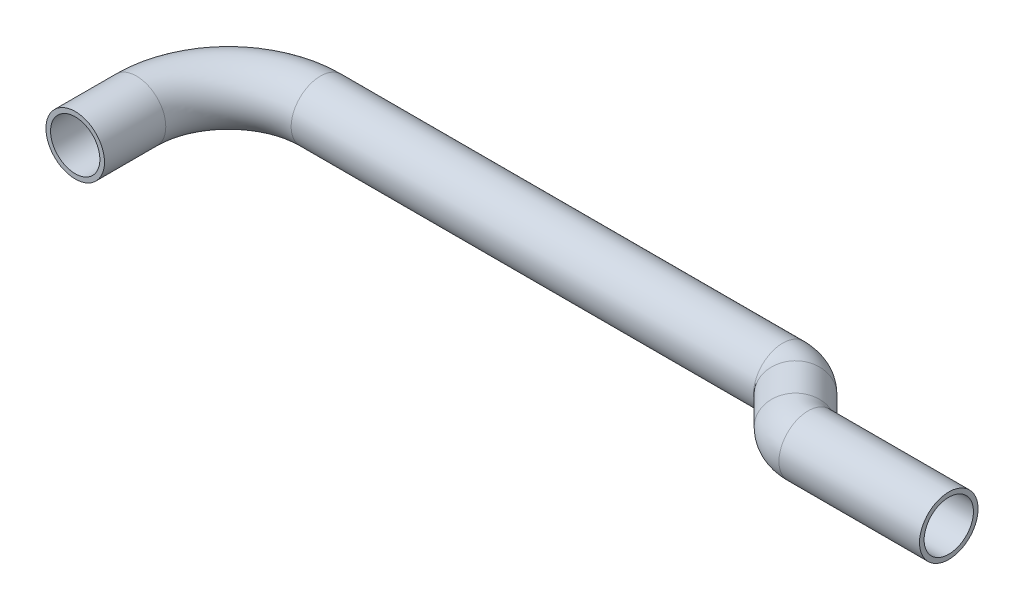
ISO-10303-21;
HEADER;
FILE_DESCRIPTION(('STEP AP214'),'2;1');
FILE_NAME('part.step','',(''),(''),'','','');
FILE_SCHEMA(('AUTOMOTIVE_DESIGN { 1 0 10303 214 1 1 1 1 }'));
ENDSEC;
DATA;
#1=APPLICATION_CONTEXT('core data for automotive mechanical design processes');
#2=APPLICATION_PROTOCOL_DEFINITION('international standard','automotive_design',2000,#1);
#3=PRODUCT_CONTEXT('',#1,'mechanical');
#4=PRODUCT('Part','Part','',(#3));
#5=PRODUCT_RELATED_PRODUCT_CATEGORY('part','',(#4));
#6=PRODUCT_DEFINITION_FORMATION('','',#4);
#7=PRODUCT_DEFINITION_CONTEXT('part definition',#1,'design');
#8=PRODUCT_DEFINITION('design','',#6,#7);
#9=PRODUCT_DEFINITION_SHAPE('','',#8);
#10=(LENGTH_UNIT() NAMED_UNIT(*) SI_UNIT(.MILLI.,.METRE.));
#11=(NAMED_UNIT(*) PLANE_ANGLE_UNIT() SI_UNIT($,.RADIAN.));
#12=(NAMED_UNIT(*) SI_UNIT($,.STERADIAN.) SOLID_ANGLE_UNIT());
#13=UNCERTAINTY_MEASURE_WITH_UNIT(LENGTH_MEASURE(1.E-05),#10,'distance_accuracy_value','');
#14=(GEOMETRIC_REPRESENTATION_CONTEXT(3) GLOBAL_UNCERTAINTY_ASSIGNED_CONTEXT((#13)) GLOBAL_UNIT_ASSIGNED_CONTEXT((#10,
#11,#12)) REPRESENTATION_CONTEXT('',''));
#15=CARTESIAN_POINT('',(0.,0.,0.));
#16=DIRECTION('',(0.,0.,1.));
#17=DIRECTION('',(1.,0.,0.));
#18=AXIS2_PLACEMENT_3D('',#15,#16,#17);
#19=CARTESIAN_POINT('',(204.142135623731,0.,-35.));
#20=DIRECTION('',(1.,0.,0.));
#21=DIRECTION('',(0.,0.,-1.));
#22=AXIS2_PLACEMENT_3D('',#19,#20,#21);
#23=CYLINDRICAL_SURFACE('',#22,9.55);
#24=CARTESIAN_POINT('',(204.142135623731,0.,-35.));
#25=DIRECTION('',(-1.,0.,0.));
#26=DIRECTION('',(0.,0.,1.));
#27=AXIS2_PLACEMENT_3D('',#24,#25,#26);
#28=CIRCLE('',#27,9.55);
#29=CARTESIAN_POINT('',(204.142135623731,0.,-25.45));
#30=VERTEX_POINT('',#29);
#31=EDGE_CURVE('E41',#30,#30,#28,.T.);
#32=ORIENTED_EDGE('',*,*,#31,.F.);
#33=EDGE_LOOP('',(#32));
#34=FACE_BOUND('',#33,.T.);
#35=CARTESIAN_POINT('',(250.,0.,-35.));
#36=DIRECTION('',(-1.,0.,0.));
#37=DIRECTION('',(0.,0.,1.));
#38=AXIS2_PLACEMENT_3D('',#35,#36,#37);
#39=CIRCLE('',#38,9.55);
#40=CARTESIAN_POINT('',(250.,0.,-25.45));
#41=VERTEX_POINT('',#40);
#42=EDGE_CURVE('E10',#41,#41,#39,.T.);
#43=ORIENTED_EDGE('',*,*,#42,.T.);
#44=EDGE_LOOP('',(#43));
#45=FACE_BOUND('',#44,.T.);
#46=ADVANCED_FACE('F31',(#34,#45),#23,.T.);
#47=CARTESIAN_POINT('',(204.142135623731,0.,-35.));
#48=DIRECTION('',(1.,0.,0.));
#49=DIRECTION('',(0.,0.,-1.));
#50=AXIS2_PLACEMENT_3D('',#47,#48,#49);
#51=CYLINDRICAL_SURFACE('',#50,8.05);
#52=CARTESIAN_POINT('',(204.142135623731,0.,-35.));
#53=DIRECTION('',(-1.,0.,0.));
#54=DIRECTION('',(0.,0.,1.));
#55=AXIS2_PLACEMENT_3D('',#52,#53,#54);
#56=CIRCLE('',#55,8.05);
#57=CARTESIAN_POINT('',(204.142135623731,0.,-26.95));
#58=VERTEX_POINT('',#57);
#59=EDGE_CURVE('E45',#58,#58,#56,.T.);
#60=ORIENTED_EDGE('',*,*,#59,.T.);
#61=EDGE_LOOP('',(#60));
#62=FACE_BOUND('',#61,.T.);
#63=CARTESIAN_POINT('',(250.,0.,-35.));
#64=DIRECTION('',(-1.,0.,0.));
#65=DIRECTION('',(0.,0.,1.));
#66=AXIS2_PLACEMENT_3D('',#63,#64,#65);
#67=CIRCLE('',#66,8.05);
#68=CARTESIAN_POINT('',(250.,0.,-26.95));
#69=VERTEX_POINT('',#68);
#70=EDGE_CURVE('E37',#69,#69,#67,.T.);
#71=ORIENTED_EDGE('',*,*,#70,.F.);
#72=EDGE_LOOP('',(#71));
#73=FACE_BOUND('',#72,.T.);
#74=ADVANCED_FACE('F112',(#62,#73),#51,.F.);
#75=CARTESIAN_POINT('',(204.142135623731,0.,-45.));
#76=DIRECTION('',(0.,1.,0.));
#77=DIRECTION('',(0.,0.,1.));
#78=AXIS2_PLACEMENT_3D('',#75,#76,#77);
#79=TOROIDAL_SURFACE('',#78,9.99999999999997,9.55);
#80=CARTESIAN_POINT('',(197.071067811865,0.,-37.9289321881346));
#81=DIRECTION('',(-0.70710678118654,0.,-0.707106781186555));
#82=DIRECTION('',(-0.707106781186555,0.,0.70710678118654));
#83=AXIS2_PLACEMENT_3D('',#80,#81,#82);
#84=CIRCLE('',#83,9.55);
#85=CARTESIAN_POINT('',(190.318198051534,0.,-31.1760624278031));
#86=VERTEX_POINT('',#85);
#87=EDGE_CURVE('E50',#86,#86,#84,.T.);
#88=CARTESIAN_POINT('',(204.142135623731,0.,-45.));
#89=DIRECTION('',(0.,1.,0.));
#90=DIRECTION('',(0.,0.,1.));
#91=AXIS2_PLACEMENT_3D('',#88,#89,#90);
#92=CIRCLE('',#91,19.55);
#93=EDGE_CURVE('',#86,#30,#92,.T.);
#94=ORIENTED_EDGE('',*,*,#87,.F.);
#95=ORIENTED_EDGE('',*,*,#31,.T.);
#96=ORIENTED_EDGE('',*,*,#93,.T.);
#97=ORIENTED_EDGE('',*,*,#93,.F.);
#98=EDGE_LOOP('',(#94,#96,#95,#97));
#99=FACE_BOUND('',#98,.T.);
#100=ADVANCED_FACE('F117',(#99),#79,.T.);
#101=CARTESIAN_POINT('',(204.142135623731,0.,-45.));
#102=DIRECTION('',(0.,1.,0.));
#103=DIRECTION('',(0.,0.,1.));
#104=AXIS2_PLACEMENT_3D('',#101,#102,#103);
#105=TOROIDAL_SURFACE('',#104,9.99999999999997,8.05);
#106=CARTESIAN_POINT('',(197.071067811865,0.,-37.9289321881346));
#107=DIRECTION('',(-0.70710678118654,0.,-0.707106781186555));
#108=DIRECTION('',(-0.707106781186555,0.,0.70710678118654));
#109=AXIS2_PLACEMENT_3D('',#106,#107,#108);
#110=CIRCLE('',#109,8.05);
#111=CARTESIAN_POINT('',(191.378858223314,0.,-32.2367225995829));
#112=VERTEX_POINT('',#111);
#113=EDGE_CURVE('E53',#112,#112,#110,.T.);
#114=CARTESIAN_POINT('',(204.142135623731,0.,-45.));
#115=DIRECTION('',(0.,1.,0.));
#116=DIRECTION('',(0.,0.,1.));
#117=AXIS2_PLACEMENT_3D('',#114,#115,#116);
#118=CIRCLE('',#117,18.05);
#119=EDGE_CURVE('',#112,#58,#118,.T.);
#120=ORIENTED_EDGE('',*,*,#113,.T.);
#121=ORIENTED_EDGE('',*,*,#59,.F.);
#122=ORIENTED_EDGE('',*,*,#119,.T.);
#123=ORIENTED_EDGE('',*,*,#119,.F.);
#124=EDGE_LOOP('',(#120,#122,#121,#123));
#125=FACE_BOUND('',#124,.T.);
#126=ADVANCED_FACE('F122',(#125),#105,.F.);
#127=CARTESIAN_POINT('',(187.928932188135,0.,-47.0710678118654));
#128=DIRECTION('',(0.707106781186546,0.,0.707106781186549));
#129=DIRECTION('',(0.707106781186549,0.,-0.707106781186546));
#130=AXIS2_PLACEMENT_3D('',#127,#128,#129);
#131=CYLINDRICAL_SURFACE('',#130,9.55);
#132=CARTESIAN_POINT('',(187.928932188135,0.,-47.0710678118654));
#133=DIRECTION('',(-0.70710678118654,0.,-0.707106781186555));
#134=DIRECTION('',(-0.707106781186555,0.,0.70710678118654));
#135=AXIS2_PLACEMENT_3D('',#132,#133,#134);
#136=CIRCLE('',#135,9.55);
#137=CARTESIAN_POINT('',(194.681801948466,0.,-53.8239375721969));
#138=VERTEX_POINT('',#137);
#139=EDGE_CURVE('E56',#138,#138,#136,.T.);
#140=ORIENTED_EDGE('',*,*,#139,.F.);
#141=EDGE_LOOP('',(#140));
#142=FACE_BOUND('',#141,.T.);
#143=ORIENTED_EDGE('',*,*,#87,.T.);
#144=EDGE_LOOP('',(#143));
#145=FACE_BOUND('',#144,.T.);
#146=ADVANCED_FACE('F128',(#142,#145),#131,.T.);
#147=CARTESIAN_POINT('',(187.928932188135,0.,-47.0710678118654));
#148=DIRECTION('',(0.707106781186546,0.,0.707106781186549));
#149=DIRECTION('',(0.707106781186549,0.,-0.707106781186546));
#150=AXIS2_PLACEMENT_3D('',#147,#148,#149);
#151=CYLINDRICAL_SURFACE('',#150,8.05);
#152=CARTESIAN_POINT('',(187.928932188135,0.,-47.0710678118654));
#153=DIRECTION('',(-0.70710678118654,0.,-0.707106781186555));
#154=DIRECTION('',(-0.707106781186555,0.,0.70710678118654));
#155=AXIS2_PLACEMENT_3D('',#152,#153,#154);
#156=CIRCLE('',#155,8.05);
#157=CARTESIAN_POINT('',(193.621141776686,0.,-52.7632774004171));
#158=VERTEX_POINT('',#157);
#159=EDGE_CURVE('E59',#158,#158,#156,.T.);
#160=ORIENTED_EDGE('',*,*,#159,.T.);
#161=EDGE_LOOP('',(#160));
#162=FACE_BOUND('',#161,.T.);
#163=ORIENTED_EDGE('',*,*,#113,.F.);
#164=EDGE_LOOP('',(#163));
#165=FACE_BOUND('',#164,.T.);
#166=ADVANCED_FACE('F135',(#162,#165),#151,.F.);
#167=CARTESIAN_POINT('',(180.857864376269,0.,-40.));
#168=DIRECTION('',(0.,-1.,0.));
#169=DIRECTION('',(0.,0.,-1.));
#170=AXIS2_PLACEMENT_3D('',#167,#168,#169);
#171=TOROIDAL_SURFACE('',#170,9.99999999999999,9.55);
#172=CARTESIAN_POINT('',(180.857864376269,0.,-50.));
#173=DIRECTION('',(-1.,0.,0.));
#174=DIRECTION('',(0.,0.,1.));
#175=AXIS2_PLACEMENT_3D('',#172,#173,#174);
#176=CIRCLE('',#175,9.55);
#177=CARTESIAN_POINT('',(180.857864376269,0.,-59.55));
#178=VERTEX_POINT('',#177);
#179=EDGE_CURVE('E62',#178,#178,#176,.T.);
#180=CARTESIAN_POINT('',(180.857864376269,0.,-40.));
#181=DIRECTION('',(0.,-1.,0.));
#182=DIRECTION('',(0.,0.,-1.));
#183=AXIS2_PLACEMENT_3D('',#180,#181,#182);
#184=CIRCLE('',#183,19.55);
#185=EDGE_CURVE('',#178,#138,#184,.T.);
#186=ORIENTED_EDGE('',*,*,#179,.F.);
#187=ORIENTED_EDGE('',*,*,#139,.T.);
#188=ORIENTED_EDGE('',*,*,#185,.T.);
#189=ORIENTED_EDGE('',*,*,#185,.F.);
#190=EDGE_LOOP('',(#186,#188,#187,#189));
#191=FACE_BOUND('',#190,.T.);
#192=ADVANCED_FACE('F139',(#191),#171,.T.);
#193=CARTESIAN_POINT('',(180.857864376269,0.,-40.));
#194=DIRECTION('',(0.,-1.,0.));
#195=DIRECTION('',(0.,0.,-1.));
#196=AXIS2_PLACEMENT_3D('',#193,#194,#195);
#197=TOROIDAL_SURFACE('',#196,9.99999999999999,8.05);
#198=CARTESIAN_POINT('',(180.857864376269,0.,-50.));
#199=DIRECTION('',(-1.,0.,0.));
#200=DIRECTION('',(0.,0.,1.));
#201=AXIS2_PLACEMENT_3D('',#198,#199,#200);
#202=CIRCLE('',#201,8.05);
#203=CARTESIAN_POINT('',(180.857864376269,0.,-58.05));
#204=VERTEX_POINT('',#203);
#205=EDGE_CURVE('E65',#204,#204,#202,.T.);
#206=CARTESIAN_POINT('',(180.857864376269,0.,-40.));
#207=DIRECTION('',(0.,-1.,0.));
#208=DIRECTION('',(0.,0.,-1.));
#209=AXIS2_PLACEMENT_3D('',#206,#207,#208);
#210=CIRCLE('',#209,18.05);
#211=EDGE_CURVE('',#204,#158,#210,.T.);
#212=ORIENTED_EDGE('',*,*,#205,.T.);
#213=ORIENTED_EDGE('',*,*,#159,.F.);
#214=ORIENTED_EDGE('',*,*,#211,.T.);
#215=ORIENTED_EDGE('',*,*,#211,.F.);
#216=EDGE_LOOP('',(#212,#214,#213,#215));
#217=FACE_BOUND('',#216,.T.);
#218=ADVANCED_FACE('F143',(#217),#197,.F.);
#219=CARTESIAN_POINT('',(30.,0.,-50.));
#220=DIRECTION('',(1.,0.,0.));
#221=DIRECTION('',(0.,0.,-1.));
#222=AXIS2_PLACEMENT_3D('',#219,#220,#221);
#223=CYLINDRICAL_SURFACE('',#222,9.55);
#224=CARTESIAN_POINT('',(30.,0.,-50.));
#225=DIRECTION('',(-1.,0.,0.));
#226=DIRECTION('',(0.,0.,1.));
#227=AXIS2_PLACEMENT_3D('',#224,#225,#226);
#228=CIRCLE('',#227,9.55);
#229=CARTESIAN_POINT('',(30.,0.,-59.55));
#230=VERTEX_POINT('',#229);
#231=EDGE_CURVE('E68',#230,#230,#228,.T.);
#232=ORIENTED_EDGE('',*,*,#231,.F.);
#233=EDGE_LOOP('',(#232));
#234=FACE_BOUND('',#233,.T.);
#235=ORIENTED_EDGE('',*,*,#179,.T.);
#236=EDGE_LOOP('',(#235));
#237=FACE_BOUND('',#236,.T.);
#238=ADVANCED_FACE('F147',(#234,#237),#223,.T.);
#239=CARTESIAN_POINT('',(30.,0.,-50.));
#240=DIRECTION('',(1.,0.,0.));
#241=DIRECTION('',(0.,0.,-1.));
#242=AXIS2_PLACEMENT_3D('',#239,#240,#241);
#243=CYLINDRICAL_SURFACE('',#242,8.05);
#244=CARTESIAN_POINT('',(30.,0.,-50.));
#245=DIRECTION('',(-1.,0.,0.));
#246=DIRECTION('',(0.,0.,1.));
#247=AXIS2_PLACEMENT_3D('',#244,#245,#246);
#248=CIRCLE('',#247,8.05);
#249=CARTESIAN_POINT('',(30.,0.,-58.05));
#250=VERTEX_POINT('',#249);
#251=EDGE_CURVE('E71',#250,#250,#248,.T.);
#252=ORIENTED_EDGE('',*,*,#251,.T.);
#253=EDGE_LOOP('',(#252));
#254=FACE_BOUND('',#253,.T.);
#255=ORIENTED_EDGE('',*,*,#205,.F.);
#256=EDGE_LOOP('',(#255));
#257=FACE_BOUND('',#256,.T.);
#258=ADVANCED_FACE('F151',(#254,#257),#243,.F.);
#259=CARTESIAN_POINT('',(30.,0.,-20.));
#260=DIRECTION('',(0.,-1.,0.));
#261=DIRECTION('',(0.,0.,-1.));
#262=AXIS2_PLACEMENT_3D('',#259,#260,#261);
#263=TOROIDAL_SURFACE('',#262,30.,9.55);
#264=CARTESIAN_POINT('',(0.,0.,-20.));
#265=DIRECTION('',(0.,0.,1.));
#266=DIRECTION('',(1.,0.,0.));
#267=AXIS2_PLACEMENT_3D('',#264,#265,#266);
#268=CIRCLE('',#267,9.55);
#269=CARTESIAN_POINT('',(-9.55,0.,-20.));
#270=VERTEX_POINT('',#269);
#271=EDGE_CURVE('E74',#270,#270,#268,.T.);
#272=CARTESIAN_POINT('',(30.,0.,-20.));
#273=DIRECTION('',(0.,-1.,0.));
#274=DIRECTION('',(0.,0.,-1.));
#275=AXIS2_PLACEMENT_3D('',#272,#273,#274);
#276=CIRCLE('',#275,39.55);
#277=EDGE_CURVE('',#270,#230,#276,.T.);
#278=ORIENTED_EDGE('',*,*,#271,.F.);
#279=ORIENTED_EDGE('',*,*,#231,.T.);
#280=ORIENTED_EDGE('',*,*,#277,.T.);
#281=ORIENTED_EDGE('',*,*,#277,.F.);
#282=EDGE_LOOP('',(#278,#280,#279,#281));
#283=FACE_BOUND('',#282,.T.);
#284=ADVANCED_FACE('F155',(#283),#263,.T.);
#285=CARTESIAN_POINT('',(30.,0.,-20.));
#286=DIRECTION('',(0.,-1.,0.));
#287=DIRECTION('',(0.,0.,-1.));
#288=AXIS2_PLACEMENT_3D('',#285,#286,#287);
#289=TOROIDAL_SURFACE('',#288,30.,8.05);
#290=CARTESIAN_POINT('',(0.,0.,-20.));
#291=DIRECTION('',(0.,0.,1.));
#292=DIRECTION('',(1.,0.,0.));
#293=AXIS2_PLACEMENT_3D('',#290,#291,#292);
#294=CIRCLE('',#293,8.05);
#295=CARTESIAN_POINT('',(-8.05,0.,-20.));
#296=VERTEX_POINT('',#295);
#297=EDGE_CURVE('E78',#296,#296,#294,.T.);
#298=CARTESIAN_POINT('',(30.,0.,-20.));
#299=DIRECTION('',(0.,-1.,0.));
#300=DIRECTION('',(0.,0.,-1.));
#301=AXIS2_PLACEMENT_3D('',#298,#299,#300);
#302=CIRCLE('',#301,38.05);
#303=EDGE_CURVE('',#296,#250,#302,.T.);
#304=ORIENTED_EDGE('',*,*,#297,.T.);
#305=ORIENTED_EDGE('',*,*,#251,.F.);
#306=ORIENTED_EDGE('',*,*,#303,.T.);
#307=ORIENTED_EDGE('',*,*,#303,.F.);
#308=EDGE_LOOP('',(#304,#306,#305,#307));
#309=FACE_BOUND('',#308,.T.);
#310=ADVANCED_FACE('F87',(#309),#289,.F.);
#311=CARTESIAN_POINT('',(0.,0.,-20.));
#312=DIRECTION('',(0.,0.,1.));
#313=DIRECTION('',(1.,0.,0.));
#314=AXIS2_PLACEMENT_3D('',#311,#312,#313);
#315=CYLINDRICAL_SURFACE('',#314,8.05);
#316=ORIENTED_EDGE('',*,*,#297,.F.);
#317=EDGE_LOOP('',(#316));
#318=FACE_BOUND('',#317,.T.);
#319=CARTESIAN_POINT('',(0.,0.,0.));
#320=DIRECTION('',(0.,0.,1.));
#321=DIRECTION('',(1.,0.,0.));
#322=AXIS2_PLACEMENT_3D('',#319,#320,#321);
#323=CIRCLE('',#322,8.05);
#324=CARTESIAN_POINT('',(8.05,0.,0.));
#325=VERTEX_POINT('',#324);
#326=EDGE_CURVE('E79',#325,#325,#323,.T.);
#327=ORIENTED_EDGE('',*,*,#326,.T.);
#328=EDGE_LOOP('',(#327));
#329=FACE_BOUND('',#328,.T.);
#330=ADVANCED_FACE('F90',(#318,#329),#315,.F.);
#331=CARTESIAN_POINT('',(0.,0.,-20.));
#332=DIRECTION('',(0.,0.,1.));
#333=DIRECTION('',(1.,0.,0.));
#334=AXIS2_PLACEMENT_3D('',#331,#332,#333);
#335=CYLINDRICAL_SURFACE('',#334,9.55);
#336=ORIENTED_EDGE('',*,*,#271,.T.);
#337=EDGE_LOOP('',(#336));
#338=FACE_BOUND('',#337,.T.);
#339=CARTESIAN_POINT('',(0.,0.,0.));
#340=DIRECTION('',(0.,0.,1.));
#341=DIRECTION('',(1.,0.,0.));
#342=AXIS2_PLACEMENT_3D('',#339,#340,#341);
#343=CIRCLE('',#342,9.55);
#344=CARTESIAN_POINT('',(9.55,0.,0.));
#345=VERTEX_POINT('',#344);
#346=EDGE_CURVE('E75',#345,#345,#343,.T.);
#347=ORIENTED_EDGE('',*,*,#346,.F.);
#348=EDGE_LOOP('',(#347));
#349=FACE_BOUND('',#348,.T.);
#350=ADVANCED_FACE('F93',(#338,#349),#335,.T.);
#351=CARTESIAN_POINT('',(250.,0.,-35.));
#352=DIRECTION('',(-1.,0.,0.));
#353=DIRECTION('',(0.,0.,1.));
#354=AXIS2_PLACEMENT_3D('',#351,#352,#353);
#355=PLANE('',#354);
#356=ORIENTED_EDGE('',*,*,#70,.T.);
#357=EDGE_LOOP('',(#356));
#358=FACE_BOUND('',#357,.T.);
#359=ORIENTED_EDGE('',*,*,#42,.F.);
#360=EDGE_LOOP('',(#359));
#361=FACE_BOUND('',#360,.T.);
#362=ADVANCED_FACE('F100',(#358,#361),#355,.F.);
#363=CARTESIAN_POINT('',(0.,0.,0.));
#364=DIRECTION('',(0.,0.,1.));
#365=DIRECTION('',(1.,0.,0.));
#366=AXIS2_PLACEMENT_3D('',#363,#364,#365);
#367=PLANE('',#366);
#368=ORIENTED_EDGE('',*,*,#326,.F.);
#369=EDGE_LOOP('',(#368));
#370=FACE_BOUND('',#369,.T.);
#371=ORIENTED_EDGE('',*,*,#346,.T.);
#372=EDGE_LOOP('',(#371));
#373=FACE_BOUND('',#372,.T.);
#374=ADVANCED_FACE('F97',(#370,#373),#367,.T.);
#375=CLOSED_SHELL('',(#46,#74,#100,#126,#146,#166,#192,#218,#238,#258,#284,#310,#330,#350,#362,#374));
#376=MANIFOLD_SOLID_BREP('B2',#375);
#377=ADVANCED_BREP_SHAPE_REPRESENTATION('',(#18,#376),#14);
#378=SHAPE_DEFINITION_REPRESENTATION(#9,#377);
ENDSEC;
END-ISO-10303-21;
